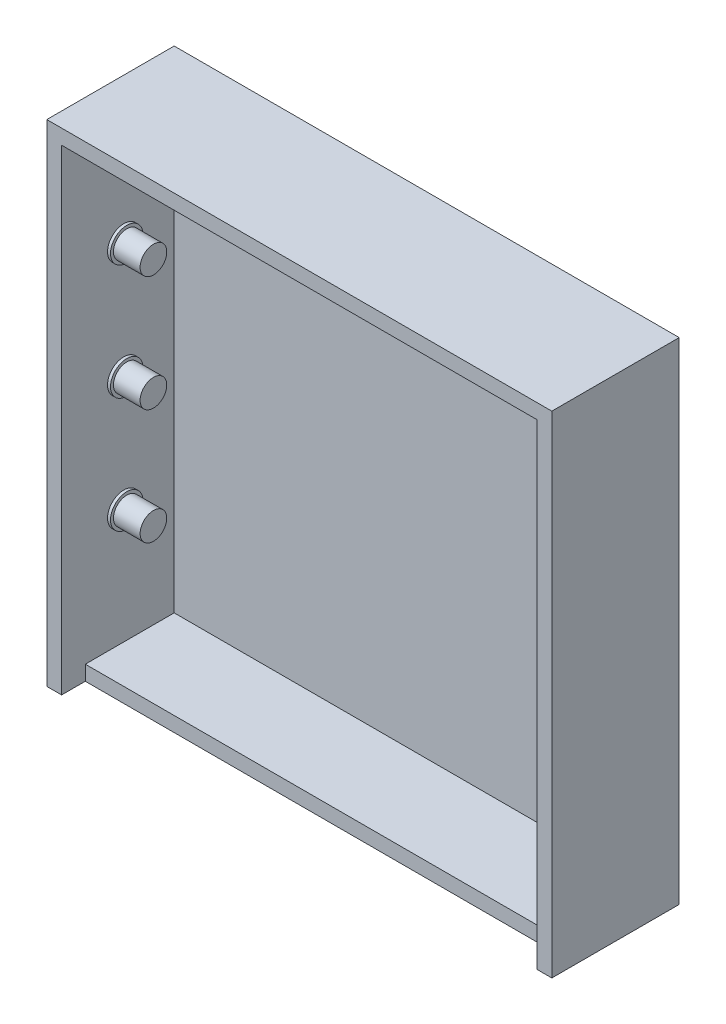
ISO-10303-21;
HEADER;
FILE_DESCRIPTION(('STEP AP214'),'2;1');
FILE_NAME('part.step','',(''),(''),'','','');
FILE_SCHEMA(('AUTOMOTIVE_DESIGN { 1 0 10303 214 1 1 1 1 }'));
ENDSEC;
DATA;
#1=APPLICATION_CONTEXT('core data for automotive mechanical design processes');
#2=APPLICATION_PROTOCOL_DEFINITION('international standard','automotive_design',2000,#1);
#3=PRODUCT_CONTEXT('',#1,'mechanical');
#4=PRODUCT('Part','Part','',(#3));
#5=PRODUCT_RELATED_PRODUCT_CATEGORY('part','',(#4));
#6=PRODUCT_DEFINITION_FORMATION('','',#4);
#7=PRODUCT_DEFINITION_CONTEXT('part definition',#1,'design');
#8=PRODUCT_DEFINITION('design','',#6,#7);
#9=PRODUCT_DEFINITION_SHAPE('','',#8);
#10=(LENGTH_UNIT() NAMED_UNIT(*) SI_UNIT(.MILLI.,.METRE.));
#11=(NAMED_UNIT(*) PLANE_ANGLE_UNIT() SI_UNIT($,.RADIAN.));
#12=(NAMED_UNIT(*) SI_UNIT($,.STERADIAN.) SOLID_ANGLE_UNIT());
#13=UNCERTAINTY_MEASURE_WITH_UNIT(LENGTH_MEASURE(1.E-05),#10,'distance_accuracy_value','');
#14=(GEOMETRIC_REPRESENTATION_CONTEXT(3) GLOBAL_UNCERTAINTY_ASSIGNED_CONTEXT((#13)) GLOBAL_UNIT_ASSIGNED_CONTEXT((#10,
#11,#12)) REPRESENTATION_CONTEXT('',''));
#15=CARTESIAN_POINT('',(0.,0.,0.));
#16=DIRECTION('',(0.,0.,1.));
#17=DIRECTION('',(1.,0.,0.));
#18=AXIS2_PLACEMENT_3D('',#15,#16,#17);
#19=CARTESIAN_POINT('',(155.47,43.9275,22.));
#20=DIRECTION('',(-1.,0.,0.));
#21=DIRECTION('',(0.,0.,1.));
#22=AXIS2_PLACEMENT_3D('',#19,#20,#21);
#23=PLANE('',#22);
#24=CARTESIAN_POINT('',(155.47,43.9275,22.));
#25=DIRECTION('',(-1.,0.,0.));
#26=DIRECTION('',(0.,0.,1.));
#27=AXIS2_PLACEMENT_3D('',#24,#25,#26);
#28=CIRCLE('',#27,4.50000000000001);
#29=CARTESIAN_POINT('',(155.47,43.9275,26.5));
#30=VERTEX_POINT('',#29);
#31=EDGE_CURVE('E215',#30,#30,#28,.T.);
#32=ORIENTED_EDGE('',*,*,#31,.T.);
#33=EDGE_LOOP('',(#32));
#34=FACE_BOUND('',#33,.T.);
#35=ADVANCED_FACE('F39',(#34),#23,.T.);
#36=CARTESIAN_POINT('',(155.47,43.9275,22.));
#37=DIRECTION('',(1.,0.,0.));
#38=DIRECTION('',(0.,0.,-1.));
#39=AXIS2_PLACEMENT_3D('',#36,#37,#38);
#40=CYLINDRICAL_SURFACE('',#39,4.50000000000001);
#41=ORIENTED_EDGE('',*,*,#31,.F.);
#42=EDGE_LOOP('',(#41));
#43=FACE_BOUND('',#42,.T.);
#44=CARTESIAN_POINT('',(164.47,43.9275,22.));
#45=DIRECTION('',(-1.,0.,0.));
#46=DIRECTION('',(0.,0.,1.));
#47=AXIS2_PLACEMENT_3D('',#44,#45,#46);
#48=CIRCLE('',#47,4.50000000000001);
#49=CARTESIAN_POINT('',(164.47,43.9275,26.5));
#50=VERTEX_POINT('',#49);
#51=EDGE_CURVE('E212',#50,#50,#48,.T.);
#52=ORIENTED_EDGE('',*,*,#51,.T.);
#53=EDGE_LOOP('',(#52));
#54=FACE_BOUND('',#53,.T.);
#55=ADVANCED_FACE('F250',(#43,#54),#40,.T.);
#56=CARTESIAN_POINT('',(164.47,43.9275,22.));
#57=DIRECTION('',(-1.,0.,0.));
#58=DIRECTION('',(0.,0.,1.));
#59=AXIS2_PLACEMENT_3D('',#56,#57,#58);
#60=PLANE('',#59);
#61=ORIENTED_EDGE('',*,*,#51,.F.);
#62=EDGE_LOOP('',(#61));
#63=FACE_BOUND('',#62,.T.);
#64=CARTESIAN_POINT('',(164.47,43.9275,22.));
#65=DIRECTION('',(-1.,0.,0.));
#66=DIRECTION('',(0.,0.,1.));
#67=AXIS2_PLACEMENT_3D('',#64,#65,#66);
#68=CIRCLE('',#67,5.5);
#69=CARTESIAN_POINT('',(164.47,43.9275,27.5));
#70=VERTEX_POINT('',#69);
#71=EDGE_CURVE('E209',#70,#70,#68,.T.);
#72=ORIENTED_EDGE('',*,*,#71,.T.);
#73=EDGE_LOOP('',(#72));
#74=FACE_BOUND('',#73,.T.);
#75=ADVANCED_FACE('F255',(#63,#74),#60,.T.);
#76=CARTESIAN_POINT('',(164.47,43.9275,22.));
#77=DIRECTION('',(1.,0.,0.));
#78=DIRECTION('',(0.,0.,-1.));
#79=AXIS2_PLACEMENT_3D('',#76,#77,#78);
#80=CYLINDRICAL_SURFACE('',#79,5.5);
#81=ORIENTED_EDGE('',*,*,#71,.F.);
#82=EDGE_LOOP('',(#81));
#83=FACE_BOUND('',#82,.T.);
#84=CARTESIAN_POINT('',(165.47,43.9275,22.));
#85=DIRECTION('',(-1.,0.,0.));
#86=DIRECTION('',(0.,0.,1.));
#87=AXIS2_PLACEMENT_3D('',#84,#85,#86);
#88=CIRCLE('',#87,5.5);
#89=CARTESIAN_POINT('',(165.47,43.9275,27.5));
#90=VERTEX_POINT('',#89);
#91=EDGE_CURVE('E206',#90,#90,#88,.T.);
#92=ORIENTED_EDGE('',*,*,#91,.T.);
#93=EDGE_LOOP('',(#92));
#94=FACE_BOUND('',#93,.T.);
#95=ADVANCED_FACE('F263',(#83,#94),#80,.T.);
#96=CARTESIAN_POINT('',(5.00000000000002,4.99999999999998,43.));
#97=DIRECTION('',(0.,1.,0.));
#98=DIRECTION('',(0.,0.,1.));
#99=AXIS2_PLACEMENT_3D('',#96,#97,#98);
#100=PLANE('',#99);
#101=DIRECTION('',(0.,0.,-1.));
#102=VECTOR('',#101,1.);
#103=CARTESIAN_POINT('',(5.00000000000002,4.99999999999998,43.));
#104=LINE('',#103,#102);
#105=CARTESIAN_POINT('',(5.,4.99999999999998,35.));
#106=VERTEX_POINT('',#105);
#107=CARTESIAN_POINT('',(5.00000000000002,4.99999999999998,5.));
#108=VERTEX_POINT('',#107);
#109=EDGE_CURVE('E170',#106,#108,#104,.T.);
#110=ORIENTED_EDGE('',*,*,#109,.F.);
#111=DIRECTION('',(-1.,0.,0.));
#112=VECTOR('',#111,1.);
#113=CARTESIAN_POINT('',(5.,4.99999999999998,35.));
#114=LINE('',#113,#112);
#115=CARTESIAN_POINT('',(165.47,4.99999999999998,35.));
#116=VERTEX_POINT('',#115);
#117=EDGE_CURVE('E129',#116,#106,#114,.T.);
#118=ORIENTED_EDGE('',*,*,#117,.F.);
#119=DIRECTION('',(0.,0.,-1.));
#120=VECTOR('',#119,1.);
#121=CARTESIAN_POINT('',(165.47,4.99999999999998,43.));
#122=LINE('',#121,#120);
#123=CARTESIAN_POINT('',(165.47,4.99999999999998,5.));
#124=VERTEX_POINT('',#123);
#125=EDGE_CURVE('E168',#116,#124,#122,.T.);
#126=ORIENTED_EDGE('',*,*,#125,.T.);
#127=DIRECTION('',(1.,0.,0.));
#128=VECTOR('',#127,1.);
#129=CARTESIAN_POINT('',(5.00000000000002,4.99999999999998,5.));
#130=LINE('',#129,#128);
#131=EDGE_CURVE('E162',#108,#124,#130,.T.);
#132=ORIENTED_EDGE('',*,*,#131,.F.);
#133=EDGE_LOOP('',(#110,#118,#126,#132));
#134=FACE_BOUND('',#133,.T.);
#135=ADVANCED_FACE('F269',(#134),#100,.T.);
#136=CARTESIAN_POINT('',(0.,0.,5.));
#137=DIRECTION('',(1.,0.,0.));
#138=DIRECTION('',(0.,0.,-1.));
#139=AXIS2_PLACEMENT_3D('',#136,#137,#138);
#140=PLANE('',#139);
#141=DIRECTION('',(0.,-1.,0.));
#142=VECTOR('',#141,1.);
#143=CARTESIAN_POINT('',(0.,0.,0.));
#144=LINE('',#143,#142);
#145=CARTESIAN_POINT('',(0.,165.71,0.));
#146=VERTEX_POINT('',#145);
#147=CARTESIAN_POINT('',(0.,0.,0.));
#148=VERTEX_POINT('',#147);
#149=EDGE_CURVE('E187',#146,#148,#144,.T.);
#150=ORIENTED_EDGE('',*,*,#149,.T.);
#151=DIRECTION('',(0.,0.,-1.));
#152=VECTOR('',#151,1.);
#153=CARTESIAN_POINT('',(0.,0.,5.));
#154=LINE('',#153,#152);
#155=CARTESIAN_POINT('',(0.,0.,43.));
#156=VERTEX_POINT('',#155);
#157=EDGE_CURVE('E202',#156,#148,#154,.T.);
#158=ORIENTED_EDGE('',*,*,#157,.F.);
#159=DIRECTION('',(0.,-1.,0.));
#160=VECTOR('',#159,1.);
#161=CARTESIAN_POINT('',(0.,0.,43.));
#162=LINE('',#161,#160);
#163=CARTESIAN_POINT('',(0.,165.71,43.));
#164=VERTEX_POINT('',#163);
#165=EDGE_CURVE('E184',#164,#156,#162,.T.);
#166=ORIENTED_EDGE('',*,*,#165,.F.);
#167=DIRECTION('',(0.,0.,-1.));
#168=VECTOR('',#167,1.);
#169=CARTESIAN_POINT('',(0.,165.71,5.));
#170=LINE('',#169,#168);
#171=EDGE_CURVE('E195',#164,#146,#170,.T.);
#172=ORIENTED_EDGE('',*,*,#171,.T.);
#173=EDGE_LOOP('',(#150,#158,#166,#172));
#174=FACE_BOUND('',#173,.T.);
#175=ADVANCED_FACE('F288',(#174),#140,.F.);
#176=CARTESIAN_POINT('',(0.,0.,5.));
#177=DIRECTION('',(0.,1.,0.));
#178=DIRECTION('',(0.,0.,1.));
#179=AXIS2_PLACEMENT_3D('',#176,#177,#178);
#180=PLANE('',#179);
#181=DIRECTION('',(1.,0.,0.));
#182=VECTOR('',#181,1.);
#183=CARTESIAN_POINT('',(5.,0.,35.));
#184=LINE('',#183,#182);
#185=CARTESIAN_POINT('',(5.,0.,35.));
#186=VERTEX_POINT('',#185);
#187=CARTESIAN_POINT('',(165.47,0.,35.));
#188=VERTEX_POINT('',#187);
#189=EDGE_CURVE('E134',#186,#188,#184,.T.);
#190=ORIENTED_EDGE('',*,*,#189,.F.);
#191=DIRECTION('',(0.,0.,1.));
#192=VECTOR('',#191,1.);
#193=CARTESIAN_POINT('',(5.,0.,35.));
#194=LINE('',#193,#192);
#195=CARTESIAN_POINT('',(5.,0.,43.));
#196=VERTEX_POINT('',#195);
#197=EDGE_CURVE('E116',#186,#196,#194,.T.);
#198=ORIENTED_EDGE('',*,*,#197,.T.);
#199=DIRECTION('',(1.,0.,0.));
#200=VECTOR('',#199,1.);
#201=CARTESIAN_POINT('',(170.47,0.,43.));
#202=LINE('',#201,#200);
#203=EDGE_CURVE('E176',#156,#196,#202,.T.);
#204=ORIENTED_EDGE('',*,*,#203,.F.);
#205=ORIENTED_EDGE('',*,*,#157,.T.);
#206=DIRECTION('',(1.,0.,0.));
#207=VECTOR('',#206,1.);
#208=CARTESIAN_POINT('',(0.,0.,0.));
#209=LINE('',#208,#207);
#210=CARTESIAN_POINT('',(170.47,0.,0.));
#211=VERTEX_POINT('',#210);
#212=EDGE_CURVE('E190',#148,#211,#209,.T.);
#213=ORIENTED_EDGE('',*,*,#212,.T.);
#214=DIRECTION('',(0.,0.,-1.));
#215=VECTOR('',#214,1.);
#216=CARTESIAN_POINT('',(170.47,0.,5.));
#217=LINE('',#216,#215);
#218=CARTESIAN_POINT('',(170.47,0.,43.));
#219=VERTEX_POINT('',#218);
#220=EDGE_CURVE('E199',#219,#211,#217,.T.);
#221=ORIENTED_EDGE('',*,*,#220,.F.);
#222=CARTESIAN_POINT('',(165.47,0.,43.));
#223=VERTEX_POINT('',#222);
#224=EDGE_CURVE('E175',#223,#219,#202,.T.);
#225=ORIENTED_EDGE('',*,*,#224,.F.);
#226=DIRECTION('',(0.,0.,1.));
#227=VECTOR('',#226,1.);
#228=CARTESIAN_POINT('',(165.47,0.,35.));
#229=LINE('',#228,#227);
#230=EDGE_CURVE('E128',#188,#223,#229,.T.);
#231=ORIENTED_EDGE('',*,*,#230,.F.);
#232=EDGE_LOOP('',(#190,#198,#204,#205,#213,#221,#225,#231));
#233=FACE_BOUND('',#232,.T.);
#234=ADVANCED_FACE('F140',(#233),#180,.F.);
#235=CARTESIAN_POINT('',(170.47,0.,5.));
#236=DIRECTION('',(-1.,0.,0.));
#237=DIRECTION('',(0.,0.,1.));
#238=AXIS2_PLACEMENT_3D('',#235,#236,#237);
#239=PLANE('',#238);
#240=DIRECTION('',(0.,1.,0.));
#241=VECTOR('',#240,1.);
#242=CARTESIAN_POINT('',(170.47,0.,0.));
#243=LINE('',#242,#241);
#244=CARTESIAN_POINT('',(170.47,165.71,0.));
#245=VERTEX_POINT('',#244);
#246=EDGE_CURVE('E192',#211,#245,#243,.T.);
#247=ORIENTED_EDGE('',*,*,#246,.T.);
#248=DIRECTION('',(0.,0.,-1.));
#249=VECTOR('',#248,1.);
#250=CARTESIAN_POINT('',(170.47,165.71,5.));
#251=LINE('',#250,#249);
#252=CARTESIAN_POINT('',(170.47,165.71,43.));
#253=VERTEX_POINT('',#252);
#254=EDGE_CURVE('E197',#253,#245,#251,.T.);
#255=ORIENTED_EDGE('',*,*,#254,.F.);
#256=DIRECTION('',(0.,1.,0.));
#257=VECTOR('',#256,1.);
#258=CARTESIAN_POINT('',(170.47,165.71,43.));
#259=LINE('',#258,#257);
#260=EDGE_CURVE('E178',#219,#253,#259,.T.);
#261=ORIENTED_EDGE('',*,*,#260,.F.);
#262=ORIENTED_EDGE('',*,*,#220,.T.);
#263=EDGE_LOOP('',(#247,#255,#261,#262));
#264=FACE_BOUND('',#263,.T.);
#265=ADVANCED_FACE('F305',(#264),#239,.F.);
#266=CARTESIAN_POINT('',(0.,165.71,5.));
#267=DIRECTION('',(0.,-1.,0.));
#268=DIRECTION('',(0.,0.,-1.));
#269=AXIS2_PLACEMENT_3D('',#266,#267,#268);
#270=PLANE('',#269);
#271=DIRECTION('',(-1.,0.,0.));
#272=VECTOR('',#271,1.);
#273=CARTESIAN_POINT('',(0.,165.71,0.));
#274=LINE('',#273,#272);
#275=EDGE_CURVE('E61',#245,#146,#274,.T.);
#276=ORIENTED_EDGE('',*,*,#275,.T.);
#277=ORIENTED_EDGE('',*,*,#171,.F.);
#278=DIRECTION('',(-1.,0.,0.));
#279=VECTOR('',#278,1.);
#280=CARTESIAN_POINT('',(0.,165.71,43.));
#281=LINE('',#280,#279);
#282=EDGE_CURVE('E181',#253,#164,#281,.T.);
#283=ORIENTED_EDGE('',*,*,#282,.F.);
#284=ORIENTED_EDGE('',*,*,#254,.T.);
#285=EDGE_LOOP('',(#276,#277,#283,#284));
#286=FACE_BOUND('',#285,.T.);
#287=ADVANCED_FACE('F301',(#286),#270,.F.);
#288=CARTESIAN_POINT('',(0.,0.,0.));
#289=DIRECTION('',(0.,0.,-1.));
#290=DIRECTION('',(-1.,0.,0.));
#291=AXIS2_PLACEMENT_3D('',#288,#289,#290);
#292=PLANE('',#291);
#293=ORIENTED_EDGE('',*,*,#149,.F.);
#294=ORIENTED_EDGE('',*,*,#275,.F.);
#295=ORIENTED_EDGE('',*,*,#246,.F.);
#296=ORIENTED_EDGE('',*,*,#212,.F.);
#297=EDGE_LOOP('',(#293,#294,#295,#296));
#298=FACE_BOUND('',#297,.T.);
#299=ADVANCED_FACE('F296',(#298),#292,.T.);
#300=CARTESIAN_POINT('',(0.,0.,43.));
#301=DIRECTION('',(0.,0.,-1.));
#302=DIRECTION('',(-1.,0.,0.));
#303=AXIS2_PLACEMENT_3D('',#300,#301,#302);
#304=PLANE('',#303);
#305=ORIENTED_EDGE('',*,*,#203,.T.);
#306=DIRECTION('',(0.,-1.,0.));
#307=VECTOR('',#306,1.);
#308=CARTESIAN_POINT('',(5.,160.71,43.));
#309=LINE('',#308,#307);
#310=CARTESIAN_POINT('',(5.,160.71,43.));
#311=VERTEX_POINT('',#310);
#312=EDGE_CURVE('E123',#311,#196,#309,.T.);
#313=ORIENTED_EDGE('',*,*,#312,.F.);
#314=DIRECTION('',(-1.,0.,0.));
#315=VECTOR('',#314,1.);
#316=CARTESIAN_POINT('',(165.47,160.71,43.));
#317=LINE('',#316,#315);
#318=CARTESIAN_POINT('',(165.47,160.71,43.));
#319=VERTEX_POINT('',#318);
#320=EDGE_CURVE('E151',#319,#311,#317,.T.);
#321=ORIENTED_EDGE('',*,*,#320,.F.);
#322=DIRECTION('',(0.,1.,0.));
#323=VECTOR('',#322,1.);
#324=CARTESIAN_POINT('',(165.47,4.99999999999998,43.));
#325=LINE('',#324,#323);
#326=EDGE_CURVE('E155',#223,#319,#325,.T.);
#327=ORIENTED_EDGE('',*,*,#326,.F.);
#328=ORIENTED_EDGE('',*,*,#224,.T.);
#329=ORIENTED_EDGE('',*,*,#260,.T.);
#330=ORIENTED_EDGE('',*,*,#282,.T.);
#331=ORIENTED_EDGE('',*,*,#165,.T.);
#332=EDGE_LOOP('',(#305,#313,#321,#327,#328,#329,#330,#331));
#333=FACE_BOUND('',#332,.T.);
#334=ADVANCED_FACE('F293',(#333),#304,.F.);
#335=CARTESIAN_POINT('',(165.47,160.71,43.));
#336=DIRECTION('',(0.,-1.,0.));
#337=DIRECTION('',(1.,0.,0.));
#338=AXIS2_PLACEMENT_3D('',#335,#336,#337);
#339=PLANE('',#338);
#340=DIRECTION('',(-1.,0.,0.));
#341=VECTOR('',#340,1.);
#342=CARTESIAN_POINT('',(165.47,160.71,5.));
#343=LINE('',#342,#341);
#344=CARTESIAN_POINT('',(165.47,160.71,5.));
#345=VERTEX_POINT('',#344);
#346=CARTESIAN_POINT('',(5.,160.71,5.));
#347=VERTEX_POINT('',#346);
#348=EDGE_CURVE('E149',#345,#347,#343,.T.);
#349=ORIENTED_EDGE('',*,*,#348,.F.);
#350=DIRECTION('',(0.,0.,-1.));
#351=VECTOR('',#350,1.);
#352=CARTESIAN_POINT('',(165.47,160.71,43.));
#353=LINE('',#352,#351);
#354=EDGE_CURVE('E53',#319,#345,#353,.T.);
#355=ORIENTED_EDGE('',*,*,#354,.F.);
#356=ORIENTED_EDGE('',*,*,#320,.T.);
#357=DIRECTION('',(0.,0.,-1.));
#358=VECTOR('',#357,1.);
#359=CARTESIAN_POINT('',(5.,160.71,43.));
#360=LINE('',#359,#358);
#361=EDGE_CURVE('E172',#311,#347,#360,.T.);
#362=ORIENTED_EDGE('',*,*,#361,.T.);
#363=EDGE_LOOP('',(#349,#355,#356,#362));
#364=FACE_BOUND('',#363,.T.);
#365=ADVANCED_FACE('F228',(#364),#339,.T.);
#366=CARTESIAN_POINT('',(5.,160.71,43.));
#367=DIRECTION('',(1.,0.,0.));
#368=DIRECTION('',(0.,1.,0.));
#369=AXIS2_PLACEMENT_3D('',#366,#367,#368);
#370=PLANE('',#369);
#371=CARTESIAN_POINT('',(5.00000000000002,43.9275,22.));
#372=DIRECTION('',(1.,0.,0.));
#373=DIRECTION('',(0.,1.,0.));
#374=AXIS2_PLACEMENT_3D('',#371,#372,#373);
#375=CIRCLE('',#374,5.5);
#376=CARTESIAN_POINT('',(5.00000000000002,49.4275,22.));
#377=VERTEX_POINT('',#376);
#378=EDGE_CURVE('E11',#377,#377,#375,.T.);
#379=ORIENTED_EDGE('',*,*,#378,.F.);
#380=EDGE_LOOP('',(#379));
#381=FACE_BOUND('',#380,.T.);
#382=CARTESIAN_POINT('',(5.00000000000001,82.855,22.));
#383=DIRECTION('',(1.,0.,0.));
#384=DIRECTION('',(0.,1.,0.));
#385=AXIS2_PLACEMENT_3D('',#382,#383,#384);
#386=CIRCLE('',#385,5.5);
#387=CARTESIAN_POINT('',(5.00000000000001,88.355,22.));
#388=VERTEX_POINT('',#387);
#389=EDGE_CURVE('E46',#388,#388,#386,.T.);
#390=ORIENTED_EDGE('',*,*,#389,.F.);
#391=EDGE_LOOP('',(#390));
#392=FACE_BOUND('',#391,.T.);
#393=CARTESIAN_POINT('',(5.00000000000001,121.7825,22.));
#394=DIRECTION('',(1.,0.,0.));
#395=DIRECTION('',(0.,1.,0.));
#396=AXIS2_PLACEMENT_3D('',#393,#394,#395);
#397=CIRCLE('',#396,5.5);
#398=CARTESIAN_POINT('',(5.00000000000001,127.2825,22.));
#399=VERTEX_POINT('',#398);
#400=EDGE_CURVE('E218',#399,#399,#397,.T.);
#401=ORIENTED_EDGE('',*,*,#400,.F.);
#402=EDGE_LOOP('',(#401));
#403=FACE_BOUND('',#402,.T.);
#404=DIRECTION('',(0.,-1.,0.));
#405=VECTOR('',#404,1.);
#406=CARTESIAN_POINT('',(5.,160.71,5.));
#407=LINE('',#406,#405);
#408=EDGE_CURVE('E159',#347,#108,#407,.T.);
#409=ORIENTED_EDGE('',*,*,#408,.F.);
#410=ORIENTED_EDGE('',*,*,#361,.F.);
#411=ORIENTED_EDGE('',*,*,#312,.T.);
#412=ORIENTED_EDGE('',*,*,#197,.F.);
#413=DIRECTION('',(0.,-1.,0.));
#414=VECTOR('',#413,1.);
#415=CARTESIAN_POINT('',(5.,4.99999999999998,35.));
#416=LINE('',#415,#414);
#417=EDGE_CURVE('E119',#106,#186,#416,.T.);
#418=ORIENTED_EDGE('',*,*,#417,.F.);
#419=ORIENTED_EDGE('',*,*,#109,.T.);
#420=EDGE_LOOP('',(#409,#410,#411,#412,#418,#419));
#421=FACE_BOUND('',#420,.T.);
#422=ADVANCED_FACE('F118',(#381,#392,#403,#421),#370,.T.);
#423=CARTESIAN_POINT('',(165.47,4.99999999999998,43.));
#424=DIRECTION('',(-1.,0.,0.));
#425=DIRECTION('',(0.,0.,1.));
#426=AXIS2_PLACEMENT_3D('',#423,#424,#425);
#427=PLANE('',#426);
#428=CARTESIAN_POINT('',(165.47,82.855,22.));
#429=DIRECTION('',(-1.,0.,0.));
#430=DIRECTION('',(0.,0.,1.));
#431=AXIS2_PLACEMENT_3D('',#428,#429,#430);
#432=CIRCLE('',#431,5.5);
#433=CARTESIAN_POINT('',(165.47,82.855,27.5));
#434=VERTEX_POINT('',#433);
#435=EDGE_CURVE('E502',#434,#434,#432,.T.);
#436=ORIENTED_EDGE('',*,*,#435,.F.);
#437=EDGE_LOOP('',(#436));
#438=FACE_BOUND('',#437,.T.);
#439=CARTESIAN_POINT('',(165.47,121.7825,22.));
#440=DIRECTION('',(-1.,0.,0.));
#441=DIRECTION('',(0.,0.,1.));
#442=AXIS2_PLACEMENT_3D('',#439,#440,#441);
#443=CIRCLE('',#442,5.5);
#444=CARTESIAN_POINT('',(165.47,121.7825,27.5));
#445=VERTEX_POINT('',#444);
#446=EDGE_CURVE('E517',#445,#445,#443,.T.);
#447=ORIENTED_EDGE('',*,*,#446,.F.);
#448=EDGE_LOOP('',(#447));
#449=FACE_BOUND('',#448,.T.);
#450=DIRECTION('',(0.,1.,0.));
#451=VECTOR('',#450,1.);
#452=CARTESIAN_POINT('',(165.47,4.99999999999998,5.));
#453=LINE('',#452,#451);
#454=EDGE_CURVE('E153',#124,#345,#453,.T.);
#455=ORIENTED_EDGE('',*,*,#454,.F.);
#456=ORIENTED_EDGE('',*,*,#125,.F.);
#457=DIRECTION('',(0.,1.,0.));
#458=VECTOR('',#457,1.);
#459=CARTESIAN_POINT('',(165.47,4.99999999999998,35.));
#460=LINE('',#459,#458);
#461=EDGE_CURVE('E143',#188,#116,#460,.T.);
#462=ORIENTED_EDGE('',*,*,#461,.F.);
#463=ORIENTED_EDGE('',*,*,#230,.T.);
#464=ORIENTED_EDGE('',*,*,#326,.T.);
#465=ORIENTED_EDGE('',*,*,#354,.T.);
#466=EDGE_LOOP('',(#455,#456,#462,#463,#464,#465));
#467=FACE_BOUND('',#466,.T.);
#468=ORIENTED_EDGE('',*,*,#91,.F.);
#469=EDGE_LOOP('',(#468));
#470=FACE_BOUND('',#469,.T.);
#471=ADVANCED_FACE('F227',(#438,#449,#467,#470),#427,.T.);
#472=CARTESIAN_POINT('',(0.,0.,5.));
#473=DIRECTION('',(0.,0.,-1.));
#474=DIRECTION('',(-1.,0.,0.));
#475=AXIS2_PLACEMENT_3D('',#472,#473,#474);
#476=PLANE('',#475);
#477=ORIENTED_EDGE('',*,*,#454,.T.);
#478=ORIENTED_EDGE('',*,*,#348,.T.);
#479=ORIENTED_EDGE('',*,*,#408,.T.);
#480=ORIENTED_EDGE('',*,*,#131,.T.);
#481=EDGE_LOOP('',(#477,#478,#479,#480));
#482=FACE_BOUND('',#481,.T.);
#483=ADVANCED_FACE('F274',(#482),#476,.F.);
#484=CARTESIAN_POINT('',(0.,0.,35.));
#485=DIRECTION('',(0.,0.,1.));
#486=DIRECTION('',(1.,0.,0.));
#487=AXIS2_PLACEMENT_3D('',#484,#485,#486);
#488=PLANE('',#487);
#489=ORIENTED_EDGE('',*,*,#417,.T.);
#490=ORIENTED_EDGE('',*,*,#189,.T.);
#491=ORIENTED_EDGE('',*,*,#461,.T.);
#492=ORIENTED_EDGE('',*,*,#117,.T.);
#493=EDGE_LOOP('',(#489,#490,#491,#492));
#494=FACE_BOUND('',#493,.T.);
#495=ADVANCED_FACE('F133',(#494),#488,.T.);
#496=CARTESIAN_POINT('',(164.47,121.7825,22.));
#497=DIRECTION('',(1.,0.,0.));
#498=DIRECTION('',(0.,0.,-1.));
#499=AXIS2_PLACEMENT_3D('',#496,#497,#498);
#500=CYLINDRICAL_SURFACE('',#499,5.5);
#501=CARTESIAN_POINT('',(164.47,121.7825,22.));
#502=DIRECTION('',(-1.,0.,0.));
#503=DIRECTION('',(0.,0.,1.));
#504=AXIS2_PLACEMENT_3D('',#501,#502,#503);
#505=CIRCLE('',#504,5.5);
#506=CARTESIAN_POINT('',(164.47,121.7825,27.5));
#507=VERTEX_POINT('',#506);
#508=EDGE_CURVE('E138',#507,#507,#505,.T.);
#509=ORIENTED_EDGE('',*,*,#508,.F.);
#510=EDGE_LOOP('',(#509));
#511=FACE_BOUND('',#510,.T.);
#512=ORIENTED_EDGE('',*,*,#446,.T.);
#513=EDGE_LOOP('',(#512));
#514=FACE_BOUND('',#513,.T.);
#515=ADVANCED_FACE('F524',(#511,#514),#500,.T.);
#516=CARTESIAN_POINT('',(164.47,121.7825,22.));
#517=DIRECTION('',(-1.,0.,0.));
#518=DIRECTION('',(0.,0.,1.));
#519=AXIS2_PLACEMENT_3D('',#516,#517,#518);
#520=PLANE('',#519);
#521=CARTESIAN_POINT('',(164.47,121.7825,22.));
#522=DIRECTION('',(-1.,0.,0.));
#523=DIRECTION('',(0.,0.,1.));
#524=AXIS2_PLACEMENT_3D('',#521,#522,#523);
#525=CIRCLE('',#524,4.50000000000001);
#526=CARTESIAN_POINT('',(164.47,121.7825,26.5));
#527=VERTEX_POINT('',#526);
#528=EDGE_CURVE('E205',#527,#527,#525,.T.);
#529=ORIENTED_EDGE('',*,*,#528,.F.);
#530=EDGE_LOOP('',(#529));
#531=FACE_BOUND('',#530,.T.);
#532=ORIENTED_EDGE('',*,*,#508,.T.);
#533=EDGE_LOOP('',(#532));
#534=FACE_BOUND('',#533,.T.);
#535=ADVANCED_FACE('F526',(#531,#534),#520,.T.);
#536=CARTESIAN_POINT('',(155.47,121.7825,22.));
#537=DIRECTION('',(1.,0.,0.));
#538=DIRECTION('',(0.,0.,-1.));
#539=AXIS2_PLACEMENT_3D('',#536,#537,#538);
#540=CYLINDRICAL_SURFACE('',#539,4.50000000000001);
#541=CARTESIAN_POINT('',(155.47,121.7825,22.));
#542=DIRECTION('',(-1.,0.,0.));
#543=DIRECTION('',(0.,0.,1.));
#544=AXIS2_PLACEMENT_3D('',#541,#542,#543);
#545=CIRCLE('',#544,4.50000000000001);
#546=CARTESIAN_POINT('',(155.47,121.7825,26.5));
#547=VERTEX_POINT('',#546);
#548=EDGE_CURVE('E514',#547,#547,#545,.T.);
#549=ORIENTED_EDGE('',*,*,#548,.F.);
#550=EDGE_LOOP('',(#549));
#551=FACE_BOUND('',#550,.T.);
#552=ORIENTED_EDGE('',*,*,#528,.T.);
#553=EDGE_LOOP('',(#552));
#554=FACE_BOUND('',#553,.T.);
#555=ADVANCED_FACE('F532',(#551,#554),#540,.T.);
#556=CARTESIAN_POINT('',(155.47,121.7825,22.));
#557=DIRECTION('',(-1.,0.,0.));
#558=DIRECTION('',(0.,0.,1.));
#559=AXIS2_PLACEMENT_3D('',#556,#557,#558);
#560=PLANE('',#559);
#561=ORIENTED_EDGE('',*,*,#548,.T.);
#562=EDGE_LOOP('',(#561));
#563=FACE_BOUND('',#562,.T.);
#564=ADVANCED_FACE('F539',(#563),#560,.T.);
#565=CARTESIAN_POINT('',(164.47,82.855,22.));
#566=DIRECTION('',(1.,0.,0.));
#567=DIRECTION('',(0.,0.,-1.));
#568=AXIS2_PLACEMENT_3D('',#565,#566,#567);
#569=CYLINDRICAL_SURFACE('',#568,5.5);
#570=CARTESIAN_POINT('',(164.47,82.855,22.));
#571=DIRECTION('',(-1.,0.,0.));
#572=DIRECTION('',(0.,0.,1.));
#573=AXIS2_PLACEMENT_3D('',#570,#571,#572);
#574=CIRCLE('',#573,5.5);
#575=CARTESIAN_POINT('',(164.47,82.855,27.5));
#576=VERTEX_POINT('',#575);
#577=EDGE_CURVE('E511',#576,#576,#574,.T.);
#578=ORIENTED_EDGE('',*,*,#577,.F.);
#579=EDGE_LOOP('',(#578));
#580=FACE_BOUND('',#579,.T.);
#581=ORIENTED_EDGE('',*,*,#435,.T.);
#582=EDGE_LOOP('',(#581));
#583=FACE_BOUND('',#582,.T.);
#584=ADVANCED_FACE('F543',(#580,#583),#569,.T.);
#585=CARTESIAN_POINT('',(164.47,82.855,22.));
#586=DIRECTION('',(-1.,0.,0.));
#587=DIRECTION('',(0.,0.,1.));
#588=AXIS2_PLACEMENT_3D('',#585,#586,#587);
#589=PLANE('',#588);
#590=CARTESIAN_POINT('',(164.47,82.855,22.));
#591=DIRECTION('',(-1.,0.,0.));
#592=DIRECTION('',(0.,0.,1.));
#593=AXIS2_PLACEMENT_3D('',#590,#591,#592);
#594=CIRCLE('',#593,4.50000000000001);
#595=CARTESIAN_POINT('',(164.47,82.855,26.5));
#596=VERTEX_POINT('',#595);
#597=EDGE_CURVE('E508',#596,#596,#594,.T.);
#598=ORIENTED_EDGE('',*,*,#597,.F.);
#599=EDGE_LOOP('',(#598));
#600=FACE_BOUND('',#599,.T.);
#601=ORIENTED_EDGE('',*,*,#577,.T.);
#602=EDGE_LOOP('',(#601));
#603=FACE_BOUND('',#602,.T.);
#604=ADVANCED_FACE('F547',(#600,#603),#589,.T.);
#605=CARTESIAN_POINT('',(155.47,82.855,22.));
#606=DIRECTION('',(1.,0.,0.));
#607=DIRECTION('',(0.,0.,-1.));
#608=AXIS2_PLACEMENT_3D('',#605,#606,#607);
#609=CYLINDRICAL_SURFACE('',#608,4.50000000000001);
#610=CARTESIAN_POINT('',(155.47,82.855,22.));
#611=DIRECTION('',(-1.,0.,0.));
#612=DIRECTION('',(0.,0.,1.));
#613=AXIS2_PLACEMENT_3D('',#610,#611,#612);
#614=CIRCLE('',#613,4.50000000000001);
#615=CARTESIAN_POINT('',(155.47,82.855,26.5));
#616=VERTEX_POINT('',#615);
#617=EDGE_CURVE('E505',#616,#616,#614,.T.);
#618=ORIENTED_EDGE('',*,*,#617,.F.);
#619=EDGE_LOOP('',(#618));
#620=FACE_BOUND('',#619,.T.);
#621=ORIENTED_EDGE('',*,*,#597,.T.);
#622=EDGE_LOOP('',(#621));
#623=FACE_BOUND('',#622,.T.);
#624=ADVANCED_FACE('F245',(#620,#623),#609,.T.);
#625=CARTESIAN_POINT('',(155.47,82.855,22.));
#626=DIRECTION('',(-1.,0.,0.));
#627=DIRECTION('',(0.,0.,1.));
#628=AXIS2_PLACEMENT_3D('',#625,#626,#627);
#629=PLANE('',#628);
#630=ORIENTED_EDGE('',*,*,#617,.T.);
#631=EDGE_LOOP('',(#630));
#632=FACE_BOUND('',#631,.T.);
#633=ADVANCED_FACE('F236',(#632),#629,.T.);
#634=CARTESIAN_POINT('',(5.99999999999998,121.7825,22.));
#635=DIRECTION('',(-1.,0.,0.));
#636=DIRECTION('',(0.,0.,1.));
#637=AXIS2_PLACEMENT_3D('',#634,#635,#636);
#638=CYLINDRICAL_SURFACE('',#637,5.5);
#639=CARTESIAN_POINT('',(5.99999999999998,121.7825,22.));
#640=DIRECTION('',(-1.,0.,0.));
#641=DIRECTION('',(0.,0.,1.));
#642=AXIS2_PLACEMENT_3D('',#639,#640,#641);
#643=CIRCLE('',#642,5.5);
#644=CARTESIAN_POINT('',(5.99999999999998,121.7825,27.5));
#645=VERTEX_POINT('',#644);
#646=EDGE_CURVE('E500',#645,#645,#643,.T.);
#647=ORIENTED_EDGE('',*,*,#646,.T.);
#648=EDGE_LOOP('',(#647));
#649=FACE_BOUND('',#648,.T.);
#650=ORIENTED_EDGE('',*,*,#400,.T.);
#651=EDGE_LOOP('',(#650));
#652=FACE_BOUND('',#651,.T.);
#653=ADVANCED_FACE('F233',(#649,#652),#638,.T.);
#654=CARTESIAN_POINT('',(5.99999999999998,121.7825,22.));
#655=DIRECTION('',(1.,0.,0.));
#656=DIRECTION('',(0.,0.,1.));
#657=AXIS2_PLACEMENT_3D('',#654,#655,#656);
#658=PLANE('',#657);
#659=CARTESIAN_POINT('',(5.99999999999998,121.7825,22.));
#660=DIRECTION('',(-1.,0.,0.));
#661=DIRECTION('',(0.,0.,1.));
#662=AXIS2_PLACEMENT_3D('',#659,#660,#661);
#663=CIRCLE('',#662,4.50000000000001);
#664=CARTESIAN_POINT('',(5.99999999999998,121.7825,26.5));
#665=VERTEX_POINT('',#664);
#666=EDGE_CURVE('E487',#665,#665,#663,.T.);
#667=ORIENTED_EDGE('',*,*,#666,.T.);
#668=EDGE_LOOP('',(#667));
#669=FACE_BOUND('',#668,.T.);
#670=ORIENTED_EDGE('',*,*,#646,.F.);
#671=EDGE_LOOP('',(#670));
#672=FACE_BOUND('',#671,.T.);
#673=ADVANCED_FACE('F235',(#669,#672),#658,.T.);
#674=CARTESIAN_POINT('',(5.99999999999998,82.855,22.));
#675=DIRECTION('',(-1.,0.,0.));
#676=DIRECTION('',(0.,0.,1.));
#677=AXIS2_PLACEMENT_3D('',#674,#675,#676);
#678=CYLINDRICAL_SURFACE('',#677,5.5);
#679=CARTESIAN_POINT('',(5.99999999999998,82.855,22.));
#680=DIRECTION('',(-1.,0.,0.));
#681=DIRECTION('',(0.,0.,1.));
#682=AXIS2_PLACEMENT_3D('',#679,#680,#681);
#683=CIRCLE('',#682,5.5);
#684=CARTESIAN_POINT('',(5.99999999999998,82.855,27.5));
#685=VERTEX_POINT('',#684);
#686=EDGE_CURVE('E497',#685,#685,#683,.T.);
#687=ORIENTED_EDGE('',*,*,#686,.T.);
#688=EDGE_LOOP('',(#687));
#689=FACE_BOUND('',#688,.T.);
#690=ORIENTED_EDGE('',*,*,#389,.T.);
#691=EDGE_LOOP('',(#690));
#692=FACE_BOUND('',#691,.T.);
#693=ADVANCED_FACE('F223',(#689,#692),#678,.T.);
#694=CARTESIAN_POINT('',(5.99999999999998,82.855,22.));
#695=DIRECTION('',(1.,0.,0.));
#696=DIRECTION('',(0.,0.,1.));
#697=AXIS2_PLACEMENT_3D('',#694,#695,#696);
#698=PLANE('',#697);
#699=CARTESIAN_POINT('',(5.99999999999998,82.855,22.));
#700=DIRECTION('',(-1.,0.,0.));
#701=DIRECTION('',(0.,0.,1.));
#702=AXIS2_PLACEMENT_3D('',#699,#700,#701);
#703=CIRCLE('',#702,4.50000000000001);
#704=CARTESIAN_POINT('',(5.99999999999998,82.855,26.5));
#705=VERTEX_POINT('',#704);
#706=EDGE_CURVE('E477',#705,#705,#703,.T.);
#707=ORIENTED_EDGE('',*,*,#706,.T.);
#708=EDGE_LOOP('',(#707));
#709=FACE_BOUND('',#708,.T.);
#710=ORIENTED_EDGE('',*,*,#686,.F.);
#711=EDGE_LOOP('',(#710));
#712=FACE_BOUND('',#711,.T.);
#713=ADVANCED_FACE('F380',(#709,#712),#698,.T.);
#714=CARTESIAN_POINT('',(5.99999999999998,43.9275,22.));
#715=DIRECTION('',(-1.,0.,0.));
#716=DIRECTION('',(0.,0.,1.));
#717=AXIS2_PLACEMENT_3D('',#714,#715,#716);
#718=CYLINDRICAL_SURFACE('',#717,5.5);
#719=CARTESIAN_POINT('',(5.99999999999998,43.9275,22.));
#720=DIRECTION('',(-1.,0.,0.));
#721=DIRECTION('',(0.,0.,1.));
#722=AXIS2_PLACEMENT_3D('',#719,#720,#721);
#723=CIRCLE('',#722,5.5);
#724=CARTESIAN_POINT('',(5.99999999999998,43.9275,27.5));
#725=VERTEX_POINT('',#724);
#726=EDGE_CURVE('E492',#725,#725,#723,.T.);
#727=ORIENTED_EDGE('',*,*,#726,.T.);
#728=EDGE_LOOP('',(#727));
#729=FACE_BOUND('',#728,.T.);
#730=ORIENTED_EDGE('',*,*,#378,.T.);
#731=EDGE_LOOP('',(#730));
#732=FACE_BOUND('',#731,.T.);
#733=ADVANCED_FACE('F390',(#729,#732),#718,.T.);
#734=CARTESIAN_POINT('',(5.99999999999998,43.9275,22.));
#735=DIRECTION('',(1.,0.,0.));
#736=DIRECTION('',(0.,0.,1.));
#737=AXIS2_PLACEMENT_3D('',#734,#735,#736);
#738=PLANE('',#737);
#739=CARTESIAN_POINT('',(5.99999999999998,43.9275,22.));
#740=DIRECTION('',(-1.,0.,0.));
#741=DIRECTION('',(0.,0.,1.));
#742=AXIS2_PLACEMENT_3D('',#739,#740,#741);
#743=CIRCLE('',#742,4.50000000000001);
#744=CARTESIAN_POINT('',(5.99999999999998,43.9275,26.5));
#745=VERTEX_POINT('',#744);
#746=EDGE_CURVE('E478',#745,#745,#743,.T.);
#747=ORIENTED_EDGE('',*,*,#746,.T.);
#748=EDGE_LOOP('',(#747));
#749=FACE_BOUND('',#748,.T.);
#750=ORIENTED_EDGE('',*,*,#726,.F.);
#751=EDGE_LOOP('',(#750));
#752=FACE_BOUND('',#751,.T.);
#753=ADVANCED_FACE('F400',(#749,#752),#738,.T.);
#754=CARTESIAN_POINT('',(15.,121.7825,22.));
#755=DIRECTION('',(-1.,0.,0.));
#756=DIRECTION('',(0.,0.,1.));
#757=AXIS2_PLACEMENT_3D('',#754,#755,#756);
#758=CYLINDRICAL_SURFACE('',#757,4.50000000000001);
#759=CARTESIAN_POINT('',(15.,121.7825,22.));
#760=DIRECTION('',(-1.,0.,0.));
#761=DIRECTION('',(0.,0.,1.));
#762=AXIS2_PLACEMENT_3D('',#759,#760,#761);
#763=CIRCLE('',#762,4.50000000000001);
#764=CARTESIAN_POINT('',(15.,121.7825,26.5));
#765=VERTEX_POINT('',#764);
#766=EDGE_CURVE('E489',#765,#765,#763,.T.);
#767=ORIENTED_EDGE('',*,*,#766,.T.);
#768=EDGE_LOOP('',(#767));
#769=FACE_BOUND('',#768,.T.);
#770=ORIENTED_EDGE('',*,*,#666,.F.);
#771=EDGE_LOOP('',(#770));
#772=FACE_BOUND('',#771,.T.);
#773=ADVANCED_FACE('F410',(#769,#772),#758,.T.);
#774=CARTESIAN_POINT('',(15.,121.7825,22.));
#775=DIRECTION('',(1.,0.,0.));
#776=DIRECTION('',(0.,0.,1.));
#777=AXIS2_PLACEMENT_3D('',#774,#775,#776);
#778=PLANE('',#777);
#779=ORIENTED_EDGE('',*,*,#766,.F.);
#780=EDGE_LOOP('',(#779));
#781=FACE_BOUND('',#780,.T.);
#782=ADVANCED_FACE('F420',(#781),#778,.T.);
#783=CARTESIAN_POINT('',(15.,82.855,22.));
#784=DIRECTION('',(-1.,0.,0.));
#785=DIRECTION('',(0.,0.,1.));
#786=AXIS2_PLACEMENT_3D('',#783,#784,#785);
#787=CYLINDRICAL_SURFACE('',#786,4.50000000000001);
#788=CARTESIAN_POINT('',(15.,82.855,22.));
#789=DIRECTION('',(-1.,0.,0.));
#790=DIRECTION('',(0.,0.,1.));
#791=AXIS2_PLACEMENT_3D('',#788,#789,#790);
#792=CIRCLE('',#791,4.50000000000001);
#793=CARTESIAN_POINT('',(15.,82.855,26.5));
#794=VERTEX_POINT('',#793);
#795=EDGE_CURVE('E481',#794,#794,#792,.T.);
#796=ORIENTED_EDGE('',*,*,#795,.T.);
#797=EDGE_LOOP('',(#796));
#798=FACE_BOUND('',#797,.T.);
#799=ORIENTED_EDGE('',*,*,#706,.F.);
#800=EDGE_LOOP('',(#799));
#801=FACE_BOUND('',#800,.T.);
#802=ADVANCED_FACE('F430',(#798,#801),#787,.T.);
#803=CARTESIAN_POINT('',(15.,82.855,22.));
#804=DIRECTION('',(1.,0.,0.));
#805=DIRECTION('',(0.,0.,1.));
#806=AXIS2_PLACEMENT_3D('',#803,#804,#805);
#807=PLANE('',#806);
#808=ORIENTED_EDGE('',*,*,#795,.F.);
#809=EDGE_LOOP('',(#808));
#810=FACE_BOUND('',#809,.T.);
#811=ADVANCED_FACE('F440',(#810),#807,.T.);
#812=CARTESIAN_POINT('',(15.,43.9275,22.));
#813=DIRECTION('',(-1.,0.,0.));
#814=DIRECTION('',(0.,0.,1.));
#815=AXIS2_PLACEMENT_3D('',#812,#813,#814);
#816=CYLINDRICAL_SURFACE('',#815,4.50000000000001);
#817=CARTESIAN_POINT('',(15.,43.9275,22.));
#818=DIRECTION('',(-1.,0.,0.));
#819=DIRECTION('',(0.,0.,1.));
#820=AXIS2_PLACEMENT_3D('',#817,#818,#819);
#821=CIRCLE('',#820,4.50000000000001);
#822=CARTESIAN_POINT('',(15.,43.9275,26.5));
#823=VERTEX_POINT('',#822);
#824=EDGE_CURVE('E476',#823,#823,#821,.T.);
#825=ORIENTED_EDGE('',*,*,#824,.T.);
#826=EDGE_LOOP('',(#825));
#827=FACE_BOUND('',#826,.T.);
#828=ORIENTED_EDGE('',*,*,#746,.F.);
#829=EDGE_LOOP('',(#828));
#830=FACE_BOUND('',#829,.T.);
#831=ADVANCED_FACE('F450',(#827,#830),#816,.T.);
#832=CARTESIAN_POINT('',(15.,43.9275,22.));
#833=DIRECTION('',(1.,0.,0.));
#834=DIRECTION('',(0.,0.,1.));
#835=AXIS2_PLACEMENT_3D('',#832,#833,#834);
#836=PLANE('',#835);
#837=ORIENTED_EDGE('',*,*,#824,.F.);
#838=EDGE_LOOP('',(#837));
#839=FACE_BOUND('',#838,.T.);
#840=ADVANCED_FACE('F460',(#839),#836,.T.);
#841=CLOSED_SHELL('',(#35,#55,#75,#95,#135,#175,#234,#265,#287,#299,#334,#365,#422,#471,#483,
#495,#515,#535,#555,#564,#584,#604,#624,#633,#653,#673,#693,#713,#733,#753,#773,#782,#802,#811,
#831,#840));
#842=MANIFOLD_SOLID_BREP('B2',#841);
#843=ADVANCED_BREP_SHAPE_REPRESENTATION('',(#18,#842),#14);
#844=SHAPE_DEFINITION_REPRESENTATION(#9,#843);
ENDSEC;
END-ISO-10303-21;
